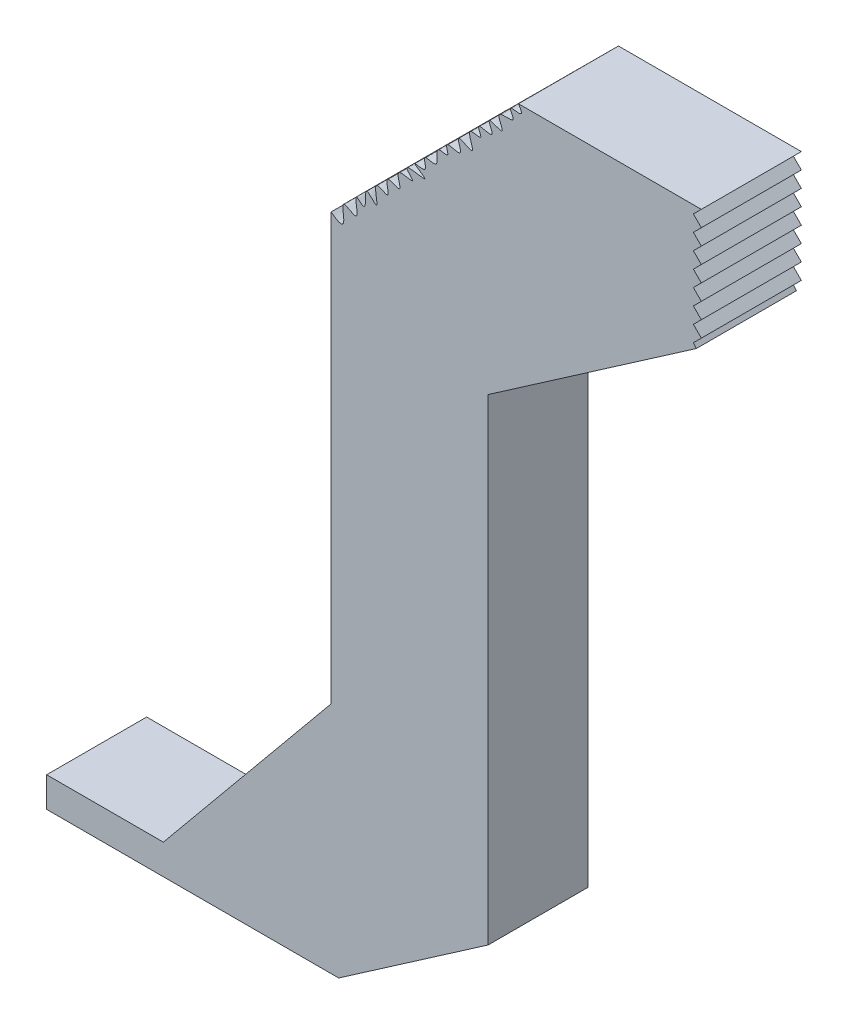
ISO-10303-21;
HEADER;
FILE_DESCRIPTION(('STEP AP214'),'2;1');
FILE_NAME('part.step','',(''),(''),'','','');
FILE_SCHEMA(('AUTOMOTIVE_DESIGN { 1 0 10303 214 1 1 1 1 }'));
ENDSEC;
DATA;
#1=APPLICATION_CONTEXT('core data for automotive mechanical design processes');
#2=APPLICATION_PROTOCOL_DEFINITION('international standard','automotive_design',2000,#1);
#3=PRODUCT_CONTEXT('',#1,'mechanical');
#4=PRODUCT('Part','Part','',(#3));
#5=PRODUCT_RELATED_PRODUCT_CATEGORY('part','',(#4));
#6=PRODUCT_DEFINITION_FORMATION('','',#4);
#7=PRODUCT_DEFINITION_CONTEXT('part definition',#1,'design');
#8=PRODUCT_DEFINITION('design','',#6,#7);
#9=PRODUCT_DEFINITION_SHAPE('','',#8);
#10=(LENGTH_UNIT() NAMED_UNIT(*) SI_UNIT(.MILLI.,.METRE.));
#11=(NAMED_UNIT(*) PLANE_ANGLE_UNIT() SI_UNIT($,.RADIAN.));
#12=(NAMED_UNIT(*) SI_UNIT($,.STERADIAN.) SOLID_ANGLE_UNIT());
#13=UNCERTAINTY_MEASURE_WITH_UNIT(LENGTH_MEASURE(1.E-05),#10,'distance_accuracy_value','');
#14=(GEOMETRIC_REPRESENTATION_CONTEXT(3) GLOBAL_UNCERTAINTY_ASSIGNED_CONTEXT((#13)) GLOBAL_UNIT_ASSIGNED_CONTEXT((#10,
#11,#12)) REPRESENTATION_CONTEXT('',''));
#15=CARTESIAN_POINT('',(0.,0.,0.));
#16=DIRECTION('',(0.,0.,1.));
#17=DIRECTION('',(1.,0.,0.));
#18=AXIS2_PLACEMENT_3D('',#15,#16,#17);
#19=CARTESIAN_POINT('',(16.8388613848185,8.64154782855645,2.));
#20=DIRECTION('',(-0.771890050200381,0.635756046295789,0.));
#21=DIRECTION('',(-0.635756046295789,-0.771890050200381,0.));
#22=AXIS2_PLACEMENT_3D('',#19,#20,#21);
#23=PLANE('',#22);
#24=DIRECTION('',(0.635756046295789,0.771890050200381,0.));
#25=VECTOR('',#24,1.);
#26=CARTESIAN_POINT('',(16.8388613848185,8.64154782855645,0.));
#27=LINE('',#26,#25);
#28=CARTESIAN_POINT('',(16.8388613848185,8.64154782855645,0.));
#29=VERTEX_POINT('',#28);
#30=CARTESIAN_POINT('',(20.1937620114081,12.7148310134571,0.));
#31=VERTEX_POINT('',#30);
#32=EDGE_CURVE('E308',#29,#31,#27,.T.);
#33=ORIENTED_EDGE('',*,*,#32,.F.);
#34=DIRECTION('',(0.,0.,-1.));
#35=VECTOR('',#34,1.);
#36=CARTESIAN_POINT('',(16.8388613848185,8.64154782855645,2.));
#37=LINE('',#36,#35);
#38=CARTESIAN_POINT('',(16.8388613848185,8.64154782855645,2.));
#39=VERTEX_POINT('',#38);
#40=EDGE_CURVE('E43',#39,#29,#37,.T.);
#41=ORIENTED_EDGE('',*,*,#40,.F.);
#42=DIRECTION('',(0.635756046295789,0.771890050200381,0.));
#43=VECTOR('',#42,1.);
#44=CARTESIAN_POINT('',(16.8388613848185,8.64154782855645,2.));
#45=LINE('',#44,#43);
#46=CARTESIAN_POINT('',(20.1937620114081,12.7148310134571,2.));
#47=VERTEX_POINT('',#46);
#48=EDGE_CURVE('E229',#39,#47,#45,.T.);
#49=ORIENTED_EDGE('',*,*,#48,.T.);
#50=DIRECTION('',(0.,0.,-1.));
#51=VECTOR('',#50,1.);
#52=CARTESIAN_POINT('',(20.1937620114081,12.7148310134571,2.));
#53=LINE('',#52,#51);
#54=EDGE_CURVE('E11',#47,#31,#53,.T.);
#55=ORIENTED_EDGE('',*,*,#54,.T.);
#56=EDGE_LOOP('',(#33,#41,#49,#55));
#57=FACE_BOUND('',#56,.T.);
#58=ADVANCED_FACE('F33',(#57),#23,.T.);
#59=CARTESIAN_POINT('',(14.50477584078,8.64154782855645,2.));
#60=DIRECTION('',(0.,1.,0.));
#61=DIRECTION('',(0.,0.,1.));
#62=AXIS2_PLACEMENT_3D('',#59,#60,#61);
#63=PLANE('',#62);
#64=DIRECTION('',(1.,0.,0.));
#65=VECTOR('',#64,1.);
#66=CARTESIAN_POINT('',(14.50477584078,8.64154782855645,0.));
#67=LINE('',#66,#65);
#68=CARTESIAN_POINT('',(14.50477584078,8.64154782855645,0.));
#69=VERTEX_POINT('',#68);
#70=EDGE_CURVE('E213',#69,#29,#67,.T.);
#71=ORIENTED_EDGE('',*,*,#70,.F.);
#72=DIRECTION('',(0.,0.,-1.));
#73=VECTOR('',#72,1.);
#74=CARTESIAN_POINT('',(14.50477584078,8.64154782855645,2.));
#75=LINE('',#74,#73);
#76=CARTESIAN_POINT('',(14.50477584078,8.64154782855645,2.));
#77=VERTEX_POINT('',#76);
#78=EDGE_CURVE('E207',#77,#69,#75,.T.);
#79=ORIENTED_EDGE('',*,*,#78,.F.);
#80=DIRECTION('',(1.,0.,0.));
#81=VECTOR('',#80,1.);
#82=CARTESIAN_POINT('',(14.50477584078,8.64154782855645,2.));
#83=LINE('',#82,#81);
#84=EDGE_CURVE('E211',#77,#39,#83,.T.);
#85=ORIENTED_EDGE('',*,*,#84,.T.);
#86=ORIENTED_EDGE('',*,*,#40,.T.);
#87=EDGE_LOOP('',(#71,#79,#85,#86));
#88=FACE_BOUND('',#87,.T.);
#89=ADVANCED_FACE('F209',(#88),#63,.T.);
#90=CARTESIAN_POINT('',(14.50477584078,8.64154782855645,2.));
#91=DIRECTION('',(1.,0.,0.));
#92=DIRECTION('',(0.,0.,-1.));
#93=AXIS2_PLACEMENT_3D('',#90,#91,#92);
#94=PLANE('',#93);
#95=DIRECTION('',(0.,-1.,0.));
#96=VECTOR('',#95,1.);
#97=CARTESIAN_POINT('',(14.50477584078,8.64154782855645,0.));
#98=LINE('',#97,#96);
#99=CARTESIAN_POINT('',(14.50477584078,8.04154782855646,0.));
#100=VERTEX_POINT('',#99);
#101=EDGE_CURVE('E305',#69,#100,#98,.T.);
#102=ORIENTED_EDGE('',*,*,#101,.T.);
#103=DIRECTION('',(0.,0.,-1.));
#104=VECTOR('',#103,1.);
#105=CARTESIAN_POINT('',(14.50477584078,8.04154782855646,2.));
#106=LINE('',#105,#104);
#107=CARTESIAN_POINT('',(14.50477584078,8.04154782855646,2.));
#108=VERTEX_POINT('',#107);
#109=EDGE_CURVE('E216',#108,#100,#106,.T.);
#110=ORIENTED_EDGE('',*,*,#109,.F.);
#111=DIRECTION('',(0.,-1.,0.));
#112=VECTOR('',#111,1.);
#113=CARTESIAN_POINT('',(14.50477584078,8.64154782855645,2.));
#114=LINE('',#113,#112);
#115=EDGE_CURVE('E220',#77,#108,#114,.T.);
#116=ORIENTED_EDGE('',*,*,#115,.F.);
#117=ORIENTED_EDGE('',*,*,#78,.T.);
#118=EDGE_LOOP('',(#102,#110,#116,#117));
#119=FACE_BOUND('',#118,.T.);
#120=ADVANCED_FACE('F221',(#119),#94,.F.);
#121=CARTESIAN_POINT('',(14.50477584078,8.04154782855646,2.));
#122=DIRECTION('',(0.,1.,0.));
#123=DIRECTION('',(0.,0.,1.));
#124=AXIS2_PLACEMENT_3D('',#121,#122,#123);
#125=PLANE('',#124);
#126=DIRECTION('',(1.,0.,0.));
#127=VECTOR('',#126,1.);
#128=CARTESIAN_POINT('',(14.50477584078,8.04154782855646,0.));
#129=LINE('',#128,#127);
#130=CARTESIAN_POINT('',(20.3447716224814,8.04154782855646,0.));
#131=VERTEX_POINT('',#130);
#132=EDGE_CURVE('E303',#100,#131,#129,.T.);
#133=ORIENTED_EDGE('',*,*,#132,.T.);
#134=DIRECTION('',(0.,0.,-1.));
#135=VECTOR('',#134,1.);
#136=CARTESIAN_POINT('',(20.3447716224814,8.04154782855646,2.));
#137=LINE('',#136,#135);
#138=CARTESIAN_POINT('',(20.3447716224814,8.04154782855646,2.));
#139=VERTEX_POINT('',#138);
#140=EDGE_CURVE('E313',#139,#131,#137,.T.);
#141=ORIENTED_EDGE('',*,*,#140,.F.);
#142=DIRECTION('',(-1.,0.,0.));
#143=VECTOR('',#142,1.);
#144=CARTESIAN_POINT('',(20.3447716224814,8.04154782855646,2.));
#145=LINE('',#144,#143);
#146=EDGE_CURVE('E225',#139,#108,#145,.T.);
#147=ORIENTED_EDGE('',*,*,#146,.T.);
#148=ORIENTED_EDGE('',*,*,#109,.T.);
#149=EDGE_LOOP('',(#133,#141,#147,#148));
#150=FACE_BOUND('',#149,.T.);
#151=ADVANCED_FACE('F376',(#150),#125,.F.);
#152=CARTESIAN_POINT('',(23.3340824481445,10.1078289370804,2.));
#153=DIRECTION('',(0.568606778075471,-0.822609465011577,0.));
#154=DIRECTION('',(0.822609465011577,0.568606778075471,0.));
#155=AXIS2_PLACEMENT_3D('',#152,#153,#154);
#156=PLANE('',#155);
#157=DIRECTION('',(-0.822609465011577,-0.568606778075471,0.));
#158=VECTOR('',#157,1.);
#159=CARTESIAN_POINT('',(23.3340824481445,10.1078289370804,0.));
#160=LINE('',#159,#158);
#161=CARTESIAN_POINT('',(23.3340824481445,10.1078289370804,0.));
#162=VERTEX_POINT('',#161);
#163=EDGE_CURVE('E300',#162,#131,#160,.T.);
#164=ORIENTED_EDGE('',*,*,#163,.F.);
#165=DIRECTION('',(0.,0.,-1.));
#166=VECTOR('',#165,1.);
#167=CARTESIAN_POINT('',(23.3340824481445,10.1078289370804,2.));
#168=LINE('',#167,#166);
#169=CARTESIAN_POINT('',(23.3340824481445,10.1078289370804,2.));
#170=VERTEX_POINT('',#169);
#171=EDGE_CURVE('E316',#170,#162,#168,.T.);
#172=ORIENTED_EDGE('',*,*,#171,.F.);
#173=DIRECTION('',(-0.822609465011577,-0.568606778075471,0.));
#174=VECTOR('',#173,1.);
#175=CARTESIAN_POINT('',(23.3340824481445,10.1078289370804,2.));
#176=LINE('',#175,#174);
#177=EDGE_CURVE('E526',#170,#139,#176,.T.);
#178=ORIENTED_EDGE('',*,*,#177,.T.);
#179=ORIENTED_EDGE('',*,*,#140,.T.);
#180=EDGE_LOOP('',(#164,#172,#178,#179));
#181=FACE_BOUND('',#180,.T.);
#182=ADVANCED_FACE('F379',(#181),#156,.T.);
#183=CARTESIAN_POINT('',(23.3340824481445,19.6411163553668,2.));
#184=DIRECTION('',(1.,0.,0.));
#185=DIRECTION('',(0.,1.,0.));
#186=AXIS2_PLACEMENT_3D('',#183,#184,#185);
#187=PLANE('',#186);
#188=DIRECTION('',(0.,-1.,0.));
#189=VECTOR('',#188,1.);
#190=CARTESIAN_POINT('',(23.3340824481445,19.6411163553668,0.));
#191=LINE('',#190,#189);
#192=CARTESIAN_POINT('',(23.3340824481445,19.6411163553668,0.));
#193=VERTEX_POINT('',#192);
#194=EDGE_CURVE('E297',#193,#162,#191,.T.);
#195=ORIENTED_EDGE('',*,*,#194,.F.);
#196=DIRECTION('',(0.,0.,-1.));
#197=VECTOR('',#196,1.);
#198=CARTESIAN_POINT('',(23.3340824481445,19.6411163553668,2.));
#199=LINE('',#198,#197);
#200=CARTESIAN_POINT('',(23.3340824481445,19.6411163553668,2.));
#201=VERTEX_POINT('',#200);
#202=EDGE_CURVE('E318',#201,#193,#199,.T.);
#203=ORIENTED_EDGE('',*,*,#202,.F.);
#204=DIRECTION('',(0.,-1.,0.));
#205=VECTOR('',#204,1.);
#206=CARTESIAN_POINT('',(23.3340824481445,19.6411163553668,2.));
#207=LINE('',#206,#205);
#208=EDGE_CURVE('E523',#201,#170,#207,.T.);
#209=ORIENTED_EDGE('',*,*,#208,.T.);
#210=ORIENTED_EDGE('',*,*,#171,.T.);
#211=EDGE_LOOP('',(#195,#203,#209,#210));
#212=FACE_BOUND('',#211,.T.);
#213=ADVANCED_FACE('F383',(#212),#187,.T.);
#214=CARTESIAN_POINT('',(24.7044869653998,20.588371803255,2.));
#215=DIRECTION('',(0.568606778075471,-0.822609465011577,0.));
#216=DIRECTION('',(0.822609465011577,0.568606778075471,0.));
#217=AXIS2_PLACEMENT_3D('',#214,#215,#216);
#218=PLANE('',#217);
#219=DIRECTION('',(-0.822609465011577,-0.568606778075471,0.));
#220=VECTOR('',#219,1.);
#221=CARTESIAN_POINT('',(24.7044869653998,20.588371803255,0.));
#222=LINE('',#221,#220);
#223=CARTESIAN_POINT('',(27.4969998375591,22.5186215931118,0.));
#224=VERTEX_POINT('',#223);
#225=EDGE_CURVE('E294',#224,#193,#222,.T.);
#226=ORIENTED_EDGE('',*,*,#225,.F.);
#227=DIRECTION('',(0.,0.,-1.));
#228=VECTOR('',#227,1.);
#229=CARTESIAN_POINT('',(27.4969998375591,22.5186215931118,2.));
#230=LINE('',#229,#228);
#231=CARTESIAN_POINT('',(27.4969998375591,22.5186215931118,2.));
#232=VERTEX_POINT('',#231);
#233=EDGE_CURVE('E320',#232,#224,#230,.T.);
#234=ORIENTED_EDGE('',*,*,#233,.F.);
#235=DIRECTION('',(-0.822609465011577,-0.56860677807547,0.));
#236=VECTOR('',#235,1.);
#237=CARTESIAN_POINT('',(27.4969998375591,22.5186215931118,2.));
#238=LINE('',#237,#236);
#239=EDGE_CURVE('E521',#232,#201,#238,.T.);
#240=ORIENTED_EDGE('',*,*,#239,.T.);
#241=ORIENTED_EDGE('',*,*,#202,.T.);
#242=EDGE_LOOP('',(#226,#234,#240,#241));
#243=FACE_BOUND('',#242,.T.);
#244=ADVANCED_FACE('F387',(#243),#218,.T.);
#245=CARTESIAN_POINT('',(27.4379424165866,22.59001828203,2.));
#246=DIRECTION('',(0.770550647317322,0.637378772723768,0.));
#247=DIRECTION('',(-0.637378772723768,0.770550647317322,0.));
#248=AXIS2_PLACEMENT_3D('',#245,#246,#247);
#249=PLANE('',#248);
#250=DIRECTION('',(0.637378772723768,-0.770550647317322,0.));
#251=VECTOR('',#250,1.);
#252=CARTESIAN_POINT('',(27.4379424165866,22.59001828203,0.));
#253=LINE('',#252,#251);
#254=CARTESIAN_POINT('',(27.4379424165866,22.59001828203,0.));
#255=VERTEX_POINT('',#254);
#256=EDGE_CURVE('E291',#255,#224,#253,.T.);
#257=ORIENTED_EDGE('',*,*,#256,.F.);
#258=DIRECTION('',(0.,0.,-1.));
#259=VECTOR('',#258,1.);
#260=CARTESIAN_POINT('',(27.4379424165866,22.59001828203,2.));
#261=LINE('',#260,#259);
#262=CARTESIAN_POINT('',(27.4379424165866,22.59001828203,2.));
#263=VERTEX_POINT('',#262);
#264=EDGE_CURVE('E323',#263,#255,#261,.T.);
#265=ORIENTED_EDGE('',*,*,#264,.F.);
#266=DIRECTION('',(0.637378772723768,-0.770550647317322,0.));
#267=VECTOR('',#266,1.);
#268=CARTESIAN_POINT('',(27.4379424165866,22.59001828203,2.));
#269=LINE('',#268,#267);
#270=EDGE_CURVE('E518',#263,#232,#269,.T.);
#271=ORIENTED_EDGE('',*,*,#270,.T.);
#272=ORIENTED_EDGE('',*,*,#233,.T.);
#273=EDGE_LOOP('',(#257,#265,#271,#272));
#274=FACE_BOUND('',#273,.T.);
#275=ADVANCED_FACE('F391',(#274),#249,.T.);
#276=CARTESIAN_POINT('',(27.5972858271414,22.7493616925848,2.));
#277=DIRECTION('',(0.70710678118664,-0.707106781186455,0.));
#278=DIRECTION('',(0.707106781186455,0.70710678118664,0.));
#279=AXIS2_PLACEMENT_3D('',#276,#277,#278);
#280=PLANE('',#279);
#281=DIRECTION('',(-0.707106781186455,-0.70710678118664,0.));
#282=VECTOR('',#281,1.);
#283=CARTESIAN_POINT('',(27.5972858271414,22.7493616925848,0.));
#284=LINE('',#283,#282);
#285=CARTESIAN_POINT('',(27.5972858271414,22.7493616925848,0.));
#286=VERTEX_POINT('',#285);
#287=EDGE_CURVE('E288',#286,#255,#284,.T.);
#288=ORIENTED_EDGE('',*,*,#287,.F.);
#289=DIRECTION('',(0.,0.,-1.));
#290=VECTOR('',#289,1.);
#291=CARTESIAN_POINT('',(27.5972858271414,22.7493616925848,2.));
#292=LINE('',#291,#290);
#293=CARTESIAN_POINT('',(27.5972858271414,22.7493616925848,2.));
#294=VERTEX_POINT('',#293);
#295=EDGE_CURVE('E325',#294,#286,#292,.T.);
#296=ORIENTED_EDGE('',*,*,#295,.F.);
#297=DIRECTION('',(-0.707106781186455,-0.70710678118664,0.));
#298=VECTOR('',#297,1.);
#299=CARTESIAN_POINT('',(27.5972858271414,22.7493616925848,2.));
#300=LINE('',#299,#298);
#301=EDGE_CURVE('E515',#294,#263,#300,.T.);
#302=ORIENTED_EDGE('',*,*,#301,.T.);
#303=ORIENTED_EDGE('',*,*,#264,.T.);
#304=EDGE_LOOP('',(#288,#296,#302,#303));
#305=FACE_BOUND('',#304,.T.);
#306=ADVANCED_FACE('F395',(#305),#280,.T.);
#307=CARTESIAN_POINT('',(27.4379424165866,22.9087051031395,2.));
#308=DIRECTION('',(0.707106781186563,0.707106781186532,0.));
#309=DIRECTION('',(-0.707106781186532,0.707106781186563,0.));
#310=AXIS2_PLACEMENT_3D('',#307,#308,#309);
#311=PLANE('',#310);
#312=DIRECTION('',(0.707106781186532,-0.707106781186563,0.));
#313=VECTOR('',#312,1.);
#314=CARTESIAN_POINT('',(27.4379424165866,22.9087051031395,0.));
#315=LINE('',#314,#313);
#316=CARTESIAN_POINT('',(27.4379424165866,22.9087051031395,0.));
#317=VERTEX_POINT('',#316);
#318=EDGE_CURVE('E285',#317,#286,#315,.T.);
#319=ORIENTED_EDGE('',*,*,#318,.F.);
#320=DIRECTION('',(0.,0.,-1.));
#321=VECTOR('',#320,1.);
#322=CARTESIAN_POINT('',(27.4379424165866,22.9087051031395,2.));
#323=LINE('',#322,#321);
#324=CARTESIAN_POINT('',(27.4379424165866,22.9087051031395,2.));
#325=VERTEX_POINT('',#324);
#326=EDGE_CURVE('E327',#325,#317,#323,.T.);
#327=ORIENTED_EDGE('',*,*,#326,.F.);
#328=DIRECTION('',(0.707106781186532,-0.707106781186563,0.));
#329=VECTOR('',#328,1.);
#330=CARTESIAN_POINT('',(27.4379424165866,22.9087051031395,2.));
#331=LINE('',#330,#329);
#332=EDGE_CURVE('E512',#325,#294,#331,.T.);
#333=ORIENTED_EDGE('',*,*,#332,.T.);
#334=ORIENTED_EDGE('',*,*,#295,.T.);
#335=EDGE_LOOP('',(#319,#327,#333,#334));
#336=FACE_BOUND('',#335,.T.);
#337=ADVANCED_FACE('F399',(#336),#311,.T.);
#338=CARTESIAN_POINT('',(27.5972858271414,23.0680485136943,2.));
#339=DIRECTION('',(0.707106781186532,-0.707106781186563,0.));
#340=DIRECTION('',(0.707106781186563,0.707106781186532,0.));
#341=AXIS2_PLACEMENT_3D('',#338,#339,#340);
#342=PLANE('',#341);
#343=DIRECTION('',(-0.707106781186563,-0.707106781186532,0.));
#344=VECTOR('',#343,1.);
#345=CARTESIAN_POINT('',(27.5972858271414,23.0680485136943,0.));
#346=LINE('',#345,#344);
#347=CARTESIAN_POINT('',(27.5972858271414,23.0680485136943,0.));
#348=VERTEX_POINT('',#347);
#349=EDGE_CURVE('E282',#348,#317,#346,.T.);
#350=ORIENTED_EDGE('',*,*,#349,.F.);
#351=DIRECTION('',(0.,0.,-1.));
#352=VECTOR('',#351,1.);
#353=CARTESIAN_POINT('',(27.5972858271414,23.0680485136943,2.));
#354=LINE('',#353,#352);
#355=CARTESIAN_POINT('',(27.5972858271414,23.0680485136943,2.));
#356=VERTEX_POINT('',#355);
#357=EDGE_CURVE('E329',#356,#348,#354,.T.);
#358=ORIENTED_EDGE('',*,*,#357,.F.);
#359=DIRECTION('',(-0.707106781186563,-0.707106781186532,0.));
#360=VECTOR('',#359,1.);
#361=CARTESIAN_POINT('',(27.5972858271414,23.0680485136943,2.));
#362=LINE('',#361,#360);
#363=EDGE_CURVE('E509',#356,#325,#362,.T.);
#364=ORIENTED_EDGE('',*,*,#363,.T.);
#365=ORIENTED_EDGE('',*,*,#326,.T.);
#366=EDGE_LOOP('',(#350,#358,#364,#365));
#367=FACE_BOUND('',#366,.T.);
#368=ADVANCED_FACE('F403',(#367),#342,.T.);
#369=CARTESIAN_POINT('',(27.4379424165866,23.227391924249,2.));
#370=DIRECTION('',(0.707106781186563,0.707106781186532,0.));
#371=DIRECTION('',(-0.707106781186532,0.707106781186563,0.));
#372=AXIS2_PLACEMENT_3D('',#369,#370,#371);
#373=PLANE('',#372);
#374=DIRECTION('',(0.707106781186532,-0.707106781186563,0.));
#375=VECTOR('',#374,1.);
#376=CARTESIAN_POINT('',(27.4379424165866,23.227391924249,0.));
#377=LINE('',#376,#375);
#378=CARTESIAN_POINT('',(27.4379424165866,23.227391924249,0.));
#379=VERTEX_POINT('',#378);
#380=EDGE_CURVE('E279',#379,#348,#377,.T.);
#381=ORIENTED_EDGE('',*,*,#380,.F.);
#382=DIRECTION('',(0.,0.,-1.));
#383=VECTOR('',#382,1.);
#384=CARTESIAN_POINT('',(27.4379424165866,23.227391924249,2.));
#385=LINE('',#384,#383);
#386=CARTESIAN_POINT('',(27.4379424165866,23.227391924249,2.));
#387=VERTEX_POINT('',#386);
#388=EDGE_CURVE('E331',#387,#379,#385,.T.);
#389=ORIENTED_EDGE('',*,*,#388,.F.);
#390=DIRECTION('',(0.707106781186532,-0.707106781186563,0.));
#391=VECTOR('',#390,1.);
#392=CARTESIAN_POINT('',(27.4379424165866,23.227391924249,2.));
#393=LINE('',#392,#391);
#394=EDGE_CURVE('E506',#387,#356,#393,.T.);
#395=ORIENTED_EDGE('',*,*,#394,.T.);
#396=ORIENTED_EDGE('',*,*,#357,.T.);
#397=EDGE_LOOP('',(#381,#389,#395,#396));
#398=FACE_BOUND('',#397,.T.);
#399=ADVANCED_FACE('F407',(#398),#373,.T.);
#400=CARTESIAN_POINT('',(27.5972858271414,23.3867353348038,2.));
#401=DIRECTION('',(0.70710678118654,-0.707106781186555,0.));
#402=DIRECTION('',(0.707106781186555,0.70710678118654,0.));
#403=AXIS2_PLACEMENT_3D('',#400,#401,#402);
#404=PLANE('',#403);
#405=DIRECTION('',(-0.707106781186555,-0.70710678118654,0.));
#406=VECTOR('',#405,1.);
#407=CARTESIAN_POINT('',(27.5972858271414,23.3867353348038,0.));
#408=LINE('',#407,#406);
#409=CARTESIAN_POINT('',(27.5972858271414,23.3867353348038,0.));
#410=VERTEX_POINT('',#409);
#411=EDGE_CURVE('E276',#410,#379,#408,.T.);
#412=ORIENTED_EDGE('',*,*,#411,.F.);
#413=DIRECTION('',(0.,0.,-1.));
#414=VECTOR('',#413,1.);
#415=CARTESIAN_POINT('',(27.5972858271414,23.3867353348038,2.));
#416=LINE('',#415,#414);
#417=CARTESIAN_POINT('',(27.5972858271414,23.3867353348038,2.));
#418=VERTEX_POINT('',#417);
#419=EDGE_CURVE('E333',#418,#410,#416,.T.);
#420=ORIENTED_EDGE('',*,*,#419,.F.);
#421=DIRECTION('',(-0.707106781186555,-0.70710678118654,0.));
#422=VECTOR('',#421,1.);
#423=CARTESIAN_POINT('',(27.5972858271414,23.3867353348038,2.));
#424=LINE('',#423,#422);
#425=EDGE_CURVE('E503',#418,#387,#424,.T.);
#426=ORIENTED_EDGE('',*,*,#425,.T.);
#427=ORIENTED_EDGE('',*,*,#388,.T.);
#428=EDGE_LOOP('',(#412,#420,#426,#427));
#429=FACE_BOUND('',#428,.T.);
#430=ADVANCED_FACE('F411',(#429),#404,.T.);
#431=CARTESIAN_POINT('',(27.4379424165866,23.5460787453585,2.));
#432=DIRECTION('',(0.707106781186555,0.70710678118654,0.));
#433=DIRECTION('',(-0.70710678118654,0.707106781186555,0.));
#434=AXIS2_PLACEMENT_3D('',#431,#432,#433);
#435=PLANE('',#434);
#436=DIRECTION('',(0.70710678118654,-0.707106781186555,0.));
#437=VECTOR('',#436,1.);
#438=CARTESIAN_POINT('',(27.4379424165866,23.5460787453585,0.));
#439=LINE('',#438,#437);
#440=CARTESIAN_POINT('',(27.4379424165866,23.5460787453585,0.));
#441=VERTEX_POINT('',#440);
#442=EDGE_CURVE('E273',#441,#410,#439,.T.);
#443=ORIENTED_EDGE('',*,*,#442,.F.);
#444=DIRECTION('',(0.,0.,-1.));
#445=VECTOR('',#444,1.);
#446=CARTESIAN_POINT('',(27.4379424165866,23.5460787453585,2.));
#447=LINE('',#446,#445);
#448=CARTESIAN_POINT('',(27.4379424165866,23.5460787453585,2.));
#449=VERTEX_POINT('',#448);
#450=EDGE_CURVE('E335',#449,#441,#447,.T.);
#451=ORIENTED_EDGE('',*,*,#450,.F.);
#452=DIRECTION('',(0.70710678118654,-0.707106781186555,0.));
#453=VECTOR('',#452,1.);
#454=CARTESIAN_POINT('',(27.4379424165866,23.5460787453585,2.));
#455=LINE('',#454,#453);
#456=EDGE_CURVE('E500',#449,#418,#455,.T.);
#457=ORIENTED_EDGE('',*,*,#456,.T.);
#458=ORIENTED_EDGE('',*,*,#419,.T.);
#459=EDGE_LOOP('',(#443,#451,#457,#458));
#460=FACE_BOUND('',#459,.T.);
#461=ADVANCED_FACE('F415',(#460),#435,.T.);
#462=CARTESIAN_POINT('',(27.5972858271414,23.7054221559133,2.));
#463=DIRECTION('',(0.70710678118654,-0.707106781186555,0.));
#464=DIRECTION('',(0.707106781186555,0.70710678118654,0.));
#465=AXIS2_PLACEMENT_3D('',#462,#463,#464);
#466=PLANE('',#465);
#467=DIRECTION('',(-0.707106781186555,-0.70710678118654,0.));
#468=VECTOR('',#467,1.);
#469=CARTESIAN_POINT('',(27.5972858271414,23.7054221559133,0.));
#470=LINE('',#469,#468);
#471=CARTESIAN_POINT('',(27.5972858271414,23.7054221559133,0.));
#472=VERTEX_POINT('',#471);
#473=EDGE_CURVE('E270',#472,#441,#470,.T.);
#474=ORIENTED_EDGE('',*,*,#473,.F.);
#475=DIRECTION('',(0.,0.,-1.));
#476=VECTOR('',#475,1.);
#477=CARTESIAN_POINT('',(27.5972858271414,23.7054221559133,2.));
#478=LINE('',#477,#476);
#479=CARTESIAN_POINT('',(27.5972858271414,23.7054221559133,2.));
#480=VERTEX_POINT('',#479);
#481=EDGE_CURVE('E337',#480,#472,#478,.T.);
#482=ORIENTED_EDGE('',*,*,#481,.F.);
#483=DIRECTION('',(-0.707106781186555,-0.70710678118654,0.));
#484=VECTOR('',#483,1.);
#485=CARTESIAN_POINT('',(27.5972858271414,23.7054221559133,2.));
#486=LINE('',#485,#484);
#487=EDGE_CURVE('E497',#480,#449,#486,.T.);
#488=ORIENTED_EDGE('',*,*,#487,.T.);
#489=ORIENTED_EDGE('',*,*,#450,.T.);
#490=EDGE_LOOP('',(#474,#482,#488,#489));
#491=FACE_BOUND('',#490,.T.);
#492=ADVANCED_FACE('F419',(#491),#466,.T.);
#493=CARTESIAN_POINT('',(27.4379424165866,23.864765566468,2.));
#494=DIRECTION('',(0.707106781186555,0.70710678118654,0.));
#495=DIRECTION('',(-0.70710678118654,0.707106781186555,0.));
#496=AXIS2_PLACEMENT_3D('',#493,#494,#495);
#497=PLANE('',#496);
#498=DIRECTION('',(0.70710678118654,-0.707106781186555,0.));
#499=VECTOR('',#498,1.);
#500=CARTESIAN_POINT('',(27.4379424165866,23.864765566468,0.));
#501=LINE('',#500,#499);
#502=CARTESIAN_POINT('',(27.4379424165866,23.864765566468,0.));
#503=VERTEX_POINT('',#502);
#504=EDGE_CURVE('E267',#503,#472,#501,.T.);
#505=ORIENTED_EDGE('',*,*,#504,.F.);
#506=DIRECTION('',(0.,0.,-1.));
#507=VECTOR('',#506,1.);
#508=CARTESIAN_POINT('',(27.4379424165866,23.864765566468,2.));
#509=LINE('',#508,#507);
#510=CARTESIAN_POINT('',(27.4379424165866,23.864765566468,2.));
#511=VERTEX_POINT('',#510);
#512=EDGE_CURVE('E339',#511,#503,#509,.T.);
#513=ORIENTED_EDGE('',*,*,#512,.F.);
#514=DIRECTION('',(0.70710678118654,-0.707106781186555,0.));
#515=VECTOR('',#514,1.);
#516=CARTESIAN_POINT('',(27.4379424165866,23.864765566468,2.));
#517=LINE('',#516,#515);
#518=EDGE_CURVE('E494',#511,#480,#517,.T.);
#519=ORIENTED_EDGE('',*,*,#518,.T.);
#520=ORIENTED_EDGE('',*,*,#481,.T.);
#521=EDGE_LOOP('',(#505,#513,#519,#520));
#522=FACE_BOUND('',#521,.T.);
#523=ADVANCED_FACE('F423',(#522),#497,.T.);
#524=CARTESIAN_POINT('',(27.5972858271414,24.0241089770228,2.));
#525=DIRECTION('',(0.70710678118654,-0.707106781186555,0.));
#526=DIRECTION('',(0.707106781186555,0.70710678118654,0.));
#527=AXIS2_PLACEMENT_3D('',#524,#525,#526);
#528=PLANE('',#527);
#529=DIRECTION('',(-0.707106781186555,-0.70710678118654,0.));
#530=VECTOR('',#529,1.);
#531=CARTESIAN_POINT('',(27.5972858271414,24.0241089770228,0.));
#532=LINE('',#531,#530);
#533=CARTESIAN_POINT('',(27.5972858271414,24.0241089770228,0.));
#534=VERTEX_POINT('',#533);
#535=EDGE_CURVE('E264',#534,#503,#532,.T.);
#536=ORIENTED_EDGE('',*,*,#535,.F.);
#537=DIRECTION('',(0.,0.,-1.));
#538=VECTOR('',#537,1.);
#539=CARTESIAN_POINT('',(27.5972858271414,24.0241089770228,2.));
#540=LINE('',#539,#538);
#541=CARTESIAN_POINT('',(27.5972858271414,24.0241089770228,2.));
#542=VERTEX_POINT('',#541);
#543=EDGE_CURVE('E341',#542,#534,#540,.T.);
#544=ORIENTED_EDGE('',*,*,#543,.F.);
#545=DIRECTION('',(-0.707106781186555,-0.70710678118654,0.));
#546=VECTOR('',#545,1.);
#547=CARTESIAN_POINT('',(27.5972858271414,24.0241089770228,2.));
#548=LINE('',#547,#546);
#549=EDGE_CURVE('E491',#542,#511,#548,.T.);
#550=ORIENTED_EDGE('',*,*,#549,.T.);
#551=ORIENTED_EDGE('',*,*,#512,.T.);
#552=EDGE_LOOP('',(#536,#544,#550,#551));
#553=FACE_BOUND('',#552,.T.);
#554=ADVANCED_FACE('F427',(#553),#528,.T.);
#555=CARTESIAN_POINT('',(27.4379424165866,24.1834523875775,2.));
#556=DIRECTION('',(0.707106781186555,0.70710678118654,0.));
#557=DIRECTION('',(-0.70710678118654,0.707106781186555,0.));
#558=AXIS2_PLACEMENT_3D('',#555,#556,#557);
#559=PLANE('',#558);
#560=DIRECTION('',(0.70710678118654,-0.707106781186555,0.));
#561=VECTOR('',#560,1.);
#562=CARTESIAN_POINT('',(27.4379424165866,24.1834523875775,0.));
#563=LINE('',#562,#561);
#564=CARTESIAN_POINT('',(27.4379424165866,24.1834523875775,0.));
#565=VERTEX_POINT('',#564);
#566=EDGE_CURVE('E261',#565,#534,#563,.T.);
#567=ORIENTED_EDGE('',*,*,#566,.F.);
#568=DIRECTION('',(0.,0.,-1.));
#569=VECTOR('',#568,1.);
#570=CARTESIAN_POINT('',(27.4379424165866,24.1834523875775,2.));
#571=LINE('',#570,#569);
#572=CARTESIAN_POINT('',(27.4379424165866,24.1834523875775,2.));
#573=VERTEX_POINT('',#572);
#574=EDGE_CURVE('E343',#573,#565,#571,.T.);
#575=ORIENTED_EDGE('',*,*,#574,.F.);
#576=DIRECTION('',(0.70710678118654,-0.707106781186555,0.));
#577=VECTOR('',#576,1.);
#578=CARTESIAN_POINT('',(27.4379424165866,24.1834523875775,2.));
#579=LINE('',#578,#577);
#580=EDGE_CURVE('E488',#573,#542,#579,.T.);
#581=ORIENTED_EDGE('',*,*,#580,.T.);
#582=ORIENTED_EDGE('',*,*,#543,.T.);
#583=EDGE_LOOP('',(#567,#575,#581,#582));
#584=FACE_BOUND('',#583,.T.);
#585=ADVANCED_FACE('F431',(#584),#559,.T.);
#586=CARTESIAN_POINT('',(27.5972858271414,24.3427957981323,2.));
#587=DIRECTION('',(0.707106781186547,-0.707106781186547,0.));
#588=DIRECTION('',(0.707106781186548,0.707106781186548,0.));
#589=AXIS2_PLACEMENT_3D('',#586,#587,#588);
#590=PLANE('',#589);
#591=DIRECTION('',(-0.707106781186548,-0.707106781186548,0.));
#592=VECTOR('',#591,1.);
#593=CARTESIAN_POINT('',(27.5972858271414,24.3427957981323,0.));
#594=LINE('',#593,#592);
#595=CARTESIAN_POINT('',(27.5972858271414,24.3427957981323,0.));
#596=VERTEX_POINT('',#595);
#597=EDGE_CURVE('E258',#596,#565,#594,.T.);
#598=ORIENTED_EDGE('',*,*,#597,.F.);
#599=DIRECTION('',(0.,0.,-1.));
#600=VECTOR('',#599,1.);
#601=CARTESIAN_POINT('',(27.5972858271414,24.3427957981323,2.));
#602=LINE('',#601,#600);
#603=CARTESIAN_POINT('',(27.5972858271414,24.3427957981323,2.));
#604=VERTEX_POINT('',#603);
#605=EDGE_CURVE('E345',#604,#596,#602,.T.);
#606=ORIENTED_EDGE('',*,*,#605,.F.);
#607=DIRECTION('',(-0.707106781186548,-0.707106781186548,0.));
#608=VECTOR('',#607,1.);
#609=CARTESIAN_POINT('',(27.5972858271414,24.3427957981323,2.));
#610=LINE('',#609,#608);
#611=EDGE_CURVE('E485',#604,#573,#610,.T.);
#612=ORIENTED_EDGE('',*,*,#611,.T.);
#613=ORIENTED_EDGE('',*,*,#574,.T.);
#614=EDGE_LOOP('',(#598,#606,#612,#613));
#615=FACE_BOUND('',#614,.T.);
#616=ADVANCED_FACE('F435',(#615),#590,.T.);
#617=CARTESIAN_POINT('',(27.4379424165866,24.502139208687,2.));
#618=DIRECTION('',(0.70710678118654,0.707106781186555,0.));
#619=DIRECTION('',(-0.707106781186555,0.70710678118654,0.));
#620=AXIS2_PLACEMENT_3D('',#617,#618,#619);
#621=PLANE('',#620);
#622=DIRECTION('',(0.707106781186555,-0.70710678118654,0.));
#623=VECTOR('',#622,1.);
#624=CARTESIAN_POINT('',(27.4379424165866,24.502139208687,0.));
#625=LINE('',#624,#623);
#626=CARTESIAN_POINT('',(27.4379424165866,24.502139208687,0.));
#627=VERTEX_POINT('',#626);
#628=EDGE_CURVE('E255',#627,#596,#625,.T.);
#629=ORIENTED_EDGE('',*,*,#628,.F.);
#630=DIRECTION('',(0.,0.,-1.));
#631=VECTOR('',#630,1.);
#632=CARTESIAN_POINT('',(27.4379424165866,24.502139208687,2.));
#633=LINE('',#632,#631);
#634=CARTESIAN_POINT('',(27.4379424165866,24.502139208687,2.));
#635=VERTEX_POINT('',#634);
#636=EDGE_CURVE('E347',#635,#627,#633,.T.);
#637=ORIENTED_EDGE('',*,*,#636,.F.);
#638=DIRECTION('',(0.707106781186555,-0.70710678118654,0.));
#639=VECTOR('',#638,1.);
#640=CARTESIAN_POINT('',(27.4379424165866,24.502139208687,2.));
#641=LINE('',#640,#639);
#642=EDGE_CURVE('E482',#635,#604,#641,.T.);
#643=ORIENTED_EDGE('',*,*,#642,.T.);
#644=ORIENTED_EDGE('',*,*,#605,.T.);
#645=EDGE_LOOP('',(#629,#637,#643,#644));
#646=FACE_BOUND('',#645,.T.);
#647=ADVANCED_FACE('F439',(#646),#621,.T.);
#648=CARTESIAN_POINT('',(27.5972858271414,24.6614826192418,2.));
#649=DIRECTION('',(0.707106781186555,-0.70710678118654,0.));
#650=DIRECTION('',(0.70710678118654,0.707106781186555,0.));
#651=AXIS2_PLACEMENT_3D('',#648,#649,#650);
#652=PLANE('',#651);
#653=DIRECTION('',(-0.70710678118654,-0.707106781186555,0.));
#654=VECTOR('',#653,1.);
#655=CARTESIAN_POINT('',(27.5972858271414,24.6614826192418,0.));
#656=LINE('',#655,#654);
#657=CARTESIAN_POINT('',(27.5972858271414,24.6614826192418,0.));
#658=VERTEX_POINT('',#657);
#659=EDGE_CURVE('E252',#658,#627,#656,.T.);
#660=ORIENTED_EDGE('',*,*,#659,.F.);
#661=DIRECTION('',(0.,0.,-1.));
#662=VECTOR('',#661,1.);
#663=CARTESIAN_POINT('',(27.5972858271414,24.6614826192418,2.));
#664=LINE('',#663,#662);
#665=CARTESIAN_POINT('',(27.5972858271414,24.6614826192418,2.));
#666=VERTEX_POINT('',#665);
#667=EDGE_CURVE('E349',#666,#658,#664,.T.);
#668=ORIENTED_EDGE('',*,*,#667,.F.);
#669=DIRECTION('',(-0.70710678118654,-0.707106781186555,0.));
#670=VECTOR('',#669,1.);
#671=CARTESIAN_POINT('',(27.5972858271414,24.6614826192418,2.));
#672=LINE('',#671,#670);
#673=EDGE_CURVE('E479',#666,#635,#672,.T.);
#674=ORIENTED_EDGE('',*,*,#673,.T.);
#675=ORIENTED_EDGE('',*,*,#636,.T.);
#676=EDGE_LOOP('',(#660,#668,#674,#675));
#677=FACE_BOUND('',#676,.T.);
#678=ADVANCED_FACE('F443',(#677),#652,.T.);
#679=CARTESIAN_POINT('',(27.4379424165866,24.8208260297966,2.));
#680=DIRECTION('',(0.707106781186547,0.707106781186547,0.));
#681=DIRECTION('',(-0.707106781186548,0.707106781186548,0.));
#682=AXIS2_PLACEMENT_3D('',#679,#680,#681);
#683=PLANE('',#682);
#684=DIRECTION('',(0.707106781186548,-0.707106781186548,0.));
#685=VECTOR('',#684,1.);
#686=CARTESIAN_POINT('',(27.4379424165866,24.8208260297966,0.));
#687=LINE('',#686,#685);
#688=CARTESIAN_POINT('',(27.4379424165866,24.8208260297966,0.));
#689=VERTEX_POINT('',#688);
#690=EDGE_CURVE('E249',#689,#658,#687,.T.);
#691=ORIENTED_EDGE('',*,*,#690,.F.);
#692=DIRECTION('',(0.,0.,-1.));
#693=VECTOR('',#692,1.);
#694=CARTESIAN_POINT('',(27.4379424165866,24.8208260297966,2.));
#695=LINE('',#694,#693);
#696=CARTESIAN_POINT('',(27.4379424165866,24.8208260297966,2.));
#697=VERTEX_POINT('',#696);
#698=EDGE_CURVE('E351',#697,#689,#695,.T.);
#699=ORIENTED_EDGE('',*,*,#698,.F.);
#700=DIRECTION('',(0.707106781186548,-0.707106781186548,0.));
#701=VECTOR('',#700,1.);
#702=CARTESIAN_POINT('',(27.4379424165866,24.8208260297966,2.));
#703=LINE('',#702,#701);
#704=EDGE_CURVE('E476',#697,#666,#703,.T.);
#705=ORIENTED_EDGE('',*,*,#704,.T.);
#706=ORIENTED_EDGE('',*,*,#667,.T.);
#707=EDGE_LOOP('',(#691,#699,#705,#706));
#708=FACE_BOUND('',#707,.T.);
#709=ADVANCED_FACE('F447',(#708),#683,.T.);
#710=CARTESIAN_POINT('',(27.5972858271414,24.9801694403513,2.));
#711=DIRECTION('',(0.707106781186547,-0.707106781186547,0.));
#712=DIRECTION('',(0.707106781186548,0.707106781186548,0.));
#713=AXIS2_PLACEMENT_3D('',#710,#711,#712);
#714=PLANE('',#713);
#715=DIRECTION('',(-0.707106781186548,-0.707106781186548,0.));
#716=VECTOR('',#715,1.);
#717=CARTESIAN_POINT('',(27.5972858271414,24.9801694403513,0.));
#718=LINE('',#717,#716);
#719=CARTESIAN_POINT('',(27.5972858271414,24.9801694403513,0.));
#720=VERTEX_POINT('',#719);
#721=EDGE_CURVE('E246',#720,#689,#718,.T.);
#722=ORIENTED_EDGE('',*,*,#721,.F.);
#723=DIRECTION('',(0.,0.,-1.));
#724=VECTOR('',#723,1.);
#725=CARTESIAN_POINT('',(27.5972858271414,24.9801694403513,2.));
#726=LINE('',#725,#724);
#727=CARTESIAN_POINT('',(27.5972858271414,24.9801694403513,2.));
#728=VERTEX_POINT('',#727);
#729=EDGE_CURVE('E353',#728,#720,#726,.T.);
#730=ORIENTED_EDGE('',*,*,#729,.F.);
#731=DIRECTION('',(-0.707106781186548,-0.707106781186548,0.));
#732=VECTOR('',#731,1.);
#733=CARTESIAN_POINT('',(27.5972858271414,24.9801694403513,2.));
#734=LINE('',#733,#732);
#735=EDGE_CURVE('E473',#728,#697,#734,.T.);
#736=ORIENTED_EDGE('',*,*,#735,.T.);
#737=ORIENTED_EDGE('',*,*,#698,.T.);
#738=EDGE_LOOP('',(#722,#730,#736,#737));
#739=FACE_BOUND('',#738,.T.);
#740=ADVANCED_FACE('F451',(#739),#714,.T.);
#741=CARTESIAN_POINT('',(23.9399155061268,24.9801694403513,2.));
#742=DIRECTION('',(0.,1.,0.));
#743=DIRECTION('',(-1.,0.,0.));
#744=AXIS2_PLACEMENT_3D('',#741,#742,#743);
#745=PLANE('',#744);
#746=DIRECTION('',(1.,0.,0.));
#747=VECTOR('',#746,1.);
#748=CARTESIAN_POINT('',(23.9399155061268,24.9801694403513,0.));
#749=LINE('',#748,#747);
#750=CARTESIAN_POINT('',(23.9399155061268,24.9801694403513,0.));
#751=VERTEX_POINT('',#750);
#752=EDGE_CURVE('E240',#751,#720,#749,.T.);
#753=ORIENTED_EDGE('',*,*,#752,.F.);
#754=DIRECTION('',(0.,0.,-1.));
#755=VECTOR('',#754,1.);
#756=CARTESIAN_POINT('',(23.9399155061268,24.9801694403513,2.));
#757=LINE('',#756,#755);
#758=CARTESIAN_POINT('',(23.9399155061268,24.9801694403513,2.));
#759=VERTEX_POINT('',#758);
#760=EDGE_CURVE('E354',#759,#751,#757,.T.);
#761=ORIENTED_EDGE('',*,*,#760,.F.);
#762=DIRECTION('',(1.,0.,0.));
#763=VECTOR('',#762,1.);
#764=CARTESIAN_POINT('',(23.9399155061268,24.9801694403513,2.));
#765=LINE('',#764,#763);
#766=EDGE_CURVE('E467',#759,#728,#765,.T.);
#767=ORIENTED_EDGE('',*,*,#766,.T.);
#768=ORIENTED_EDGE('',*,*,#729,.T.);
#769=EDGE_LOOP('',(#753,#761,#767,#768));
#770=FACE_BOUND('',#769,.T.);
#771=ADVANCED_FACE('F455',(#770),#745,.T.);
#772=CARTESIAN_POINT('',(20.1937620114081,21.2340159456326,2.));
#773=CARTESIAN_POINT('',(20.630326079332,20.896226808737,2.));
#774=CARTESIAN_POINT('',(20.207011543666,21.7551385321049,2.));
#775=CARTESIAN_POINT('',(20.8383581182957,21.2287671411044,2.));
#776=CARTESIAN_POINT('',(20.5896648156768,21.9090430136559,2.));
#777=CARTESIAN_POINT('',(20.9428707599249,21.5004452830644,2.));
#778=CARTESIAN_POINT('',(20.8060343005218,22.1491109612412,2.));
#779=CARTESIAN_POINT('',(21.2272149109044,21.5821906641128,2.));
#780=CARTESIAN_POINT('',(20.9616478901601,22.326037828915,2.));
#781=CARTESIAN_POINT('',(21.4413693863811,21.9484800986089,2.));
#782=CARTESIAN_POINT('',(21.1930915909943,22.5140224803186,2.));
#783=CARTESIAN_POINT('',(21.697024035221,22.1744223470251,2.));
#784=CARTESIAN_POINT('',(21.386849540446,22.7315186281449,2.));
#785=CARTESIAN_POINT('',(21.9780392627387,22.4872137635026,2.));
#786=CARTESIAN_POINT('',(21.5045716766626,22.882369453105,2.));
#787=CARTESIAN_POINT('',(22.344972241434,22.6223971696035,2.));
#788=CARTESIAN_POINT('',(21.693320732892,22.9826754858491,2.));
#789=CARTESIAN_POINT('',(22.1727391965737,22.821711797782,2.));
#790=CARTESIAN_POINT('',(21.9690406426799,23.2088009228819,2.));
#791=CARTESIAN_POINT('',(22.4149618185571,22.986546390689,2.));
#792=CARTESIAN_POINT('',(22.2193875775767,23.485797202642,2.));
#793=CARTESIAN_POINT('',(22.5976260331577,23.310514939456,2.));
#794=CARTESIAN_POINT('',(22.4077984447109,23.6689530200148,2.));
#795=CARTESIAN_POINT('',(22.912603708651,23.4048866284934,2.));
#796=CARTESIAN_POINT('',(22.608737270497,23.9422929997872,2.));
#797=CARTESIAN_POINT('',(23.1892645627397,23.5171496684177,2.));
#798=CARTESIAN_POINT('',(22.8140007919489,24.1440421166882,2.));
#799=CARTESIAN_POINT('',(23.2797900748288,23.9380484068392,2.));
#800=CARTESIAN_POINT('',(23.0254226716201,24.3030247439949,2.));
#801=CARTESIAN_POINT('',(23.5582300628485,24.0503554113258,2.));
#802=CARTESIAN_POINT('',(23.2163990081582,24.5326632366313,2.));
#803=CARTESIAN_POINT('',(23.7690258258649,24.1998171663638,2.));
#804=CARTESIAN_POINT('',(23.3847544315553,24.7243761648599,2.));
#805=CARTESIAN_POINT('',(23.9627698800158,24.5505828964633,2.));
#806=CARTESIAN_POINT('',(23.6319810000004,24.9611281607736,2.));
#807=CARTESIAN_POINT('',(24.1290793673204,24.7131533732857,2.));
#808=CARTESIAN_POINT('',(23.9399155061268,24.9801694403513,2.));
#809=B_SPLINE_CURVE_WITH_KNOTS('',3,(#772,#773,#774,#775,#776,#777,#778,#779,#780,#781,#782,
#783,#784,#785,#786,#787,#788,#789,#790,#791,#792,#793,#794,#795,#796,#797,#798,#799,#800,#801,
#802,#803,#804,#805,#806,#807,#808),.UNSPECIFIED.,.F.,.F.,(4,1,1,1,1,1,1,1,1,1,1,1,1,1,1,1,1,1,
1,1,1,1,1,1,1,1,1,1,1,1,1,1,1,1,4),(0.,0.0609478902367978,0.0900205714613889,0.127687593800745,
0.146958508741856,0.18098786877658,0.208227719587782,0.248065155354931,0.273087139012522,
0.304301670246307,0.33176747388675,0.363052825060737,0.394213617762224,0.416566097941086,
0.457513129461493,0.486638997995299,0.509347074415007,0.532055150834715,0.556986684281124,
0.58976854069932,0.609885280397249,0.628220643992195,0.658723686625115,0.686122934214265,
0.717909690379298,0.754509135191763,0.777526988281478,0.796381625619669,0.826923255840807,
0.85206650053294,0.881773627651992,0.911457795293298,0.944242402541823,0.963522089798605,1.),.UNSPECIFIED.);
#810=DIRECTION('',(0.,0.,-1.));
#811=VECTOR('',#810,1.);
#812=SURFACE_OF_LINEAR_EXTRUSION('',#809,#811);
#813=CARTESIAN_POINT('',(20.1937620114081,21.2340159456326,0.));
#814=CARTESIAN_POINT('',(20.630326079332,20.896226808737,0.));
#815=CARTESIAN_POINT('',(20.207011543666,21.7551385321049,0.));
#816=CARTESIAN_POINT('',(20.8383581182957,21.2287671411044,0.));
#817=CARTESIAN_POINT('',(20.5896648156768,21.9090430136559,0.));
#818=CARTESIAN_POINT('',(20.9428707599249,21.5004452830644,0.));
#819=CARTESIAN_POINT('',(20.8060343005218,22.1491109612412,0.));
#820=CARTESIAN_POINT('',(21.2272149109044,21.5821906641128,0.));
#821=CARTESIAN_POINT('',(20.9616478901601,22.326037828915,0.));
#822=CARTESIAN_POINT('',(21.4413693863811,21.9484800986089,0.));
#823=CARTESIAN_POINT('',(21.1930915909943,22.5140224803186,0.));
#824=CARTESIAN_POINT('',(21.697024035221,22.1744223470251,0.));
#825=CARTESIAN_POINT('',(21.386849540446,22.7315186281449,0.));
#826=CARTESIAN_POINT('',(21.9780392627387,22.4872137635026,0.));
#827=CARTESIAN_POINT('',(21.5045716766626,22.882369453105,0.));
#828=CARTESIAN_POINT('',(22.344972241434,22.6223971696035,0.));
#829=CARTESIAN_POINT('',(21.693320732892,22.9826754858491,0.));
#830=CARTESIAN_POINT('',(22.1727391965737,22.821711797782,0.));
#831=CARTESIAN_POINT('',(21.9690406426799,23.2088009228819,0.));
#832=CARTESIAN_POINT('',(22.4149618185571,22.986546390689,0.));
#833=CARTESIAN_POINT('',(22.2193875775767,23.485797202642,0.));
#834=CARTESIAN_POINT('',(22.5976260331577,23.310514939456,0.));
#835=CARTESIAN_POINT('',(22.4077984447109,23.6689530200148,0.));
#836=CARTESIAN_POINT('',(22.912603708651,23.4048866284934,0.));
#837=CARTESIAN_POINT('',(22.608737270497,23.9422929997872,0.));
#838=CARTESIAN_POINT('',(23.1892645627397,23.5171496684177,0.));
#839=CARTESIAN_POINT('',(22.8140007919489,24.1440421166882,0.));
#840=CARTESIAN_POINT('',(23.2797900748288,23.9380484068392,0.));
#841=CARTESIAN_POINT('',(23.0254226716201,24.3030247439949,0.));
#842=CARTESIAN_POINT('',(23.5582300628485,24.0503554113258,0.));
#843=CARTESIAN_POINT('',(23.2163990081582,24.5326632366313,0.));
#844=CARTESIAN_POINT('',(23.7690258258649,24.1998171663638,0.));
#845=CARTESIAN_POINT('',(23.3847544315553,24.7243761648599,0.));
#846=CARTESIAN_POINT('',(23.9627698800158,24.5505828964633,0.));
#847=CARTESIAN_POINT('',(23.6319810000004,24.9611281607736,0.));
#848=CARTESIAN_POINT('',(24.1290793673204,24.7131533732857,0.));
#849=CARTESIAN_POINT('',(23.9399155061268,24.9801694403513,0.));
#850=B_SPLINE_CURVE_WITH_KNOTS('',3,(#813,#814,#815,#816,#817,#818,#819,#820,#821,#822,#823,
#824,#825,#826,#827,#828,#829,#830,#831,#832,#833,#834,#835,#836,#837,#838,#839,#840,#841,#842,
#843,#844,#845,#846,#847,#848,#849),.UNSPECIFIED.,.F.,.F.,(4,1,1,1,1,1,1,1,1,1,1,1,1,1,1,1,1,1,
1,1,1,1,1,1,1,1,1,1,1,1,1,1,1,1,4),(0.,0.0609478902367978,0.0900205714613889,0.127687593800745,
0.146958508741856,0.18098786877658,0.208227719587782,0.248065155354931,0.273087139012522,
0.304301670246307,0.33176747388675,0.363052825060737,0.394213617762224,0.416566097941086,
0.457513129461493,0.486638997995299,0.509347074415007,0.532055150834715,0.556986684281124,
0.58976854069932,0.609885280397249,0.628220643992195,0.658723686625115,0.686122934214265,
0.717909690379298,0.754509135191763,0.777526988281478,0.796381625619669,0.826923255840807,
0.85206650053294,0.881773627651992,0.911457795293298,0.944242402541823,0.963522089798605,1.),.UNSPECIFIED.);
#851=CARTESIAN_POINT('',(20.1937620114081,21.2340159456326,0.));
#852=VERTEX_POINT('',#851);
#853=EDGE_CURVE('E235',#852,#751,#850,.T.);
#854=ORIENTED_EDGE('',*,*,#853,.F.);
#855=DIRECTION('',(0.,0.,-1.));
#856=VECTOR('',#855,1.);
#857=CARTESIAN_POINT('',(20.1937620114081,21.2340159456326,2.));
#858=LINE('',#857,#856);
#859=CARTESIAN_POINT('',(20.1937620114081,21.2340159456326,2.));
#860=VERTEX_POINT('',#859);
#861=EDGE_CURVE('E37',#860,#852,#858,.T.);
#862=ORIENTED_EDGE('',*,*,#861,.F.);
#863=EDGE_CURVE('E461',#860,#759,#809,.T.);
#864=ORIENTED_EDGE('',*,*,#863,.T.);
#865=ORIENTED_EDGE('',*,*,#760,.T.);
#866=EDGE_LOOP('',(#854,#862,#864,#865));
#867=FACE_BOUND('',#866,.T.);
#868=ADVANCED_FACE('F360',(#867),#812,.T.);
#869=CARTESIAN_POINT('',(20.1937620114081,14.6489213553334,2.));
#870=DIRECTION('',(-1.,0.,0.));
#871=DIRECTION('',(0.,0.,1.));
#872=AXIS2_PLACEMENT_3D('',#869,#870,#871);
#873=PLANE('',#872);
#874=DIRECTION('',(0.,1.,0.));
#875=VECTOR('',#874,1.);
#876=CARTESIAN_POINT('',(20.1937620114081,14.6489213553334,0.));
#877=LINE('',#876,#875);
#878=EDGE_CURVE('E136',#31,#852,#877,.T.);
#879=ORIENTED_EDGE('',*,*,#878,.F.);
#880=ORIENTED_EDGE('',*,*,#54,.F.);
#881=DIRECTION('',(0.,1.,0.));
#882=VECTOR('',#881,1.);
#883=CARTESIAN_POINT('',(20.1937620114081,12.7148310134571,2.));
#884=LINE('',#883,#882);
#885=EDGE_CURVE('E139',#47,#860,#884,.T.);
#886=ORIENTED_EDGE('',*,*,#885,.T.);
#887=ORIENTED_EDGE('',*,*,#861,.T.);
#888=EDGE_LOOP('',(#879,#880,#886,#887));
#889=FACE_BOUND('',#888,.T.);
#890=ADVANCED_FACE('F35',(#889),#873,.T.);
#891=CARTESIAN_POINT('',(21.9801554336544,22.895790804152,2.));
#892=DIRECTION('',(0.,0.,-1.));
#893=DIRECTION('',(-1.,0.,0.));
#894=AXIS2_PLACEMENT_3D('',#891,#892,#893);
#895=PLANE('',#894);
#896=ORIENTED_EDGE('',*,*,#885,.F.);
#897=ORIENTED_EDGE('',*,*,#48,.F.);
#898=ORIENTED_EDGE('',*,*,#84,.F.);
#899=ORIENTED_EDGE('',*,*,#115,.T.);
#900=ORIENTED_EDGE('',*,*,#146,.F.);
#901=ORIENTED_EDGE('',*,*,#177,.F.);
#902=ORIENTED_EDGE('',*,*,#208,.F.);
#903=ORIENTED_EDGE('',*,*,#239,.F.);
#904=ORIENTED_EDGE('',*,*,#270,.F.);
#905=ORIENTED_EDGE('',*,*,#301,.F.);
#906=ORIENTED_EDGE('',*,*,#332,.F.);
#907=ORIENTED_EDGE('',*,*,#363,.F.);
#908=ORIENTED_EDGE('',*,*,#394,.F.);
#909=ORIENTED_EDGE('',*,*,#425,.F.);
#910=ORIENTED_EDGE('',*,*,#456,.F.);
#911=ORIENTED_EDGE('',*,*,#487,.F.);
#912=ORIENTED_EDGE('',*,*,#518,.F.);
#913=ORIENTED_EDGE('',*,*,#549,.F.);
#914=ORIENTED_EDGE('',*,*,#580,.F.);
#915=ORIENTED_EDGE('',*,*,#611,.F.);
#916=ORIENTED_EDGE('',*,*,#642,.F.);
#917=ORIENTED_EDGE('',*,*,#673,.F.);
#918=ORIENTED_EDGE('',*,*,#704,.F.);
#919=ORIENTED_EDGE('',*,*,#735,.F.);
#920=ORIENTED_EDGE('',*,*,#766,.F.);
#921=ORIENTED_EDGE('',*,*,#863,.F.);
#922=EDGE_LOOP('',(#896,#897,#898,#899,#900,#901,#902,#903,#904,#905,#906,#907,#908,#909,#910,
#911,#912,#913,#914,#915,#916,#917,#918,#919,#920,#921));
#923=FACE_BOUND('',#922,.T.);
#924=ADVANCED_FACE('F227',(#923),#895,.F.);
#925=CARTESIAN_POINT('',(21.9801554336544,22.895790804152,0.));
#926=DIRECTION('',(0.,0.,-1.));
#927=DIRECTION('',(-1.,0.,0.));
#928=AXIS2_PLACEMENT_3D('',#925,#926,#927);
#929=PLANE('',#928);
#930=ORIENTED_EDGE('',*,*,#32,.T.);
#931=ORIENTED_EDGE('',*,*,#878,.T.);
#932=ORIENTED_EDGE('',*,*,#853,.T.);
#933=ORIENTED_EDGE('',*,*,#752,.T.);
#934=ORIENTED_EDGE('',*,*,#721,.T.);
#935=ORIENTED_EDGE('',*,*,#690,.T.);
#936=ORIENTED_EDGE('',*,*,#659,.T.);
#937=ORIENTED_EDGE('',*,*,#628,.T.);
#938=ORIENTED_EDGE('',*,*,#597,.T.);
#939=ORIENTED_EDGE('',*,*,#566,.T.);
#940=ORIENTED_EDGE('',*,*,#535,.T.);
#941=ORIENTED_EDGE('',*,*,#504,.T.);
#942=ORIENTED_EDGE('',*,*,#473,.T.);
#943=ORIENTED_EDGE('',*,*,#442,.T.);
#944=ORIENTED_EDGE('',*,*,#411,.T.);
#945=ORIENTED_EDGE('',*,*,#380,.T.);
#946=ORIENTED_EDGE('',*,*,#349,.T.);
#947=ORIENTED_EDGE('',*,*,#318,.T.);
#948=ORIENTED_EDGE('',*,*,#287,.T.);
#949=ORIENTED_EDGE('',*,*,#256,.T.);
#950=ORIENTED_EDGE('',*,*,#225,.T.);
#951=ORIENTED_EDGE('',*,*,#194,.T.);
#952=ORIENTED_EDGE('',*,*,#163,.T.);
#953=ORIENTED_EDGE('',*,*,#132,.F.);
#954=ORIENTED_EDGE('',*,*,#101,.F.);
#955=ORIENTED_EDGE('',*,*,#70,.T.);
#956=EDGE_LOOP('',(#930,#931,#932,#933,#934,#935,#936,#937,#938,#939,#940,#941,#942,#943,#944,
#945,#946,#947,#948,#949,#950,#951,#952,#953,#954,#955));
#957=FACE_BOUND('',#956,.T.);
#958=ADVANCED_FACE('F362',(#957),#929,.T.);
#959=CLOSED_SHELL('',(#58,#89,#120,#151,#182,#213,#244,#275,#306,#337,#368,#399,#430,#461,#492,
#523,#554,#585,#616,#647,#678,#709,#740,#771,#868,#890,#924,#958));
#960=MANIFOLD_SOLID_BREP('B2',#959);
#961=ADVANCED_BREP_SHAPE_REPRESENTATION('',(#18,#960),#14);
#962=SHAPE_DEFINITION_REPRESENTATION(#9,#961);
ENDSEC;
END-ISO-10303-21;
